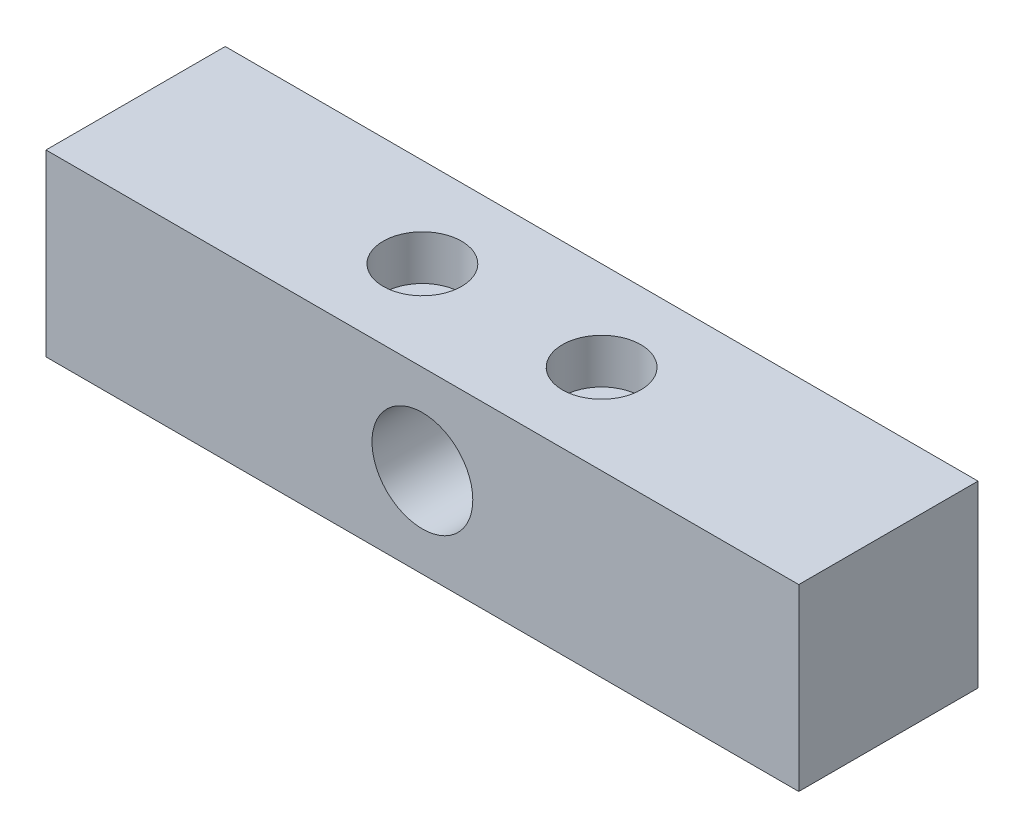
ISO-10303-21;
HEADER;
FILE_DESCRIPTION(('STEP AP214'),'2;1');
FILE_NAME('part.step','',(''),(''),'','','');
FILE_SCHEMA(('AUTOMOTIVE_DESIGN { 1 0 10303 214 1 1 1 1 }'));
ENDSEC;
DATA;
#1=APPLICATION_CONTEXT('core data for automotive mechanical design processes');
#2=APPLICATION_PROTOCOL_DEFINITION('international standard','automotive_design',2000,#1);
#3=PRODUCT_CONTEXT('',#1,'mechanical');
#4=PRODUCT('Part','Part','',(#3));
#5=PRODUCT_RELATED_PRODUCT_CATEGORY('part','',(#4));
#6=PRODUCT_DEFINITION_FORMATION('','',#4);
#7=PRODUCT_DEFINITION_CONTEXT('part definition',#1,'design');
#8=PRODUCT_DEFINITION('design','',#6,#7);
#9=PRODUCT_DEFINITION_SHAPE('','',#8);
#10=(LENGTH_UNIT() NAMED_UNIT(*) SI_UNIT(.MILLI.,.METRE.));
#11=(NAMED_UNIT(*) PLANE_ANGLE_UNIT() SI_UNIT($,.RADIAN.));
#12=(NAMED_UNIT(*) SI_UNIT($,.STERADIAN.) SOLID_ANGLE_UNIT());
#13=UNCERTAINTY_MEASURE_WITH_UNIT(LENGTH_MEASURE(1.E-05),#10,'distance_accuracy_value','');
#14=(GEOMETRIC_REPRESENTATION_CONTEXT(3) GLOBAL_UNCERTAINTY_ASSIGNED_CONTEXT((#13)) GLOBAL_UNIT_ASSIGNED_CONTEXT((#10,
#11,#12)) REPRESENTATION_CONTEXT('',''));
#15=CARTESIAN_POINT('',(0.,0.,0.));
#16=DIRECTION('',(0.,0.,1.));
#17=DIRECTION('',(1.,0.,0.));
#18=AXIS2_PLACEMENT_3D('',#15,#16,#17);
#19=CARTESIAN_POINT('',(53.34,12.7,25.4));
#20=DIRECTION('',(1.,0.,0.));
#21=DIRECTION('',(0.,0.,-1.));
#22=AXIS2_PLACEMENT_3D('',#19,#20,#21);
#23=PLANE('',#22);
#24=DIRECTION('',(0.,-1.,0.));
#25=VECTOR('',#24,1.);
#26=CARTESIAN_POINT('',(53.34,12.7,0.));
#27=LINE('',#26,#25);
#28=CARTESIAN_POINT('',(53.34,12.7,0.));
#29=VERTEX_POINT('',#28);
#30=CARTESIAN_POINT('',(53.34,-12.7,0.));
#31=VERTEX_POINT('',#30);
#32=EDGE_CURVE('E101',#29,#31,#27,.T.);
#33=ORIENTED_EDGE('',*,*,#32,.F.);
#34=DIRECTION('',(0.,0.,-1.));
#35=VECTOR('',#34,1.);
#36=CARTESIAN_POINT('',(53.34,12.7,25.4));
#37=LINE('',#36,#35);
#38=CARTESIAN_POINT('',(53.34,12.7,25.4));
#39=VERTEX_POINT('',#38);
#40=EDGE_CURVE('E11',#39,#29,#37,.T.);
#41=ORIENTED_EDGE('',*,*,#40,.F.);
#42=DIRECTION('',(0.,-1.,0.));
#43=VECTOR('',#42,1.);
#44=CARTESIAN_POINT('',(53.34,12.7,25.4));
#45=LINE('',#44,#43);
#46=CARTESIAN_POINT('',(53.34,-12.7,25.4));
#47=VERTEX_POINT('',#46);
#48=EDGE_CURVE('E95',#39,#47,#45,.T.);
#49=ORIENTED_EDGE('',*,*,#48,.T.);
#50=DIRECTION('',(0.,0.,-1.));
#51=VECTOR('',#50,1.);
#52=CARTESIAN_POINT('',(53.34,-12.7,25.4));
#53=LINE('',#52,#51);
#54=EDGE_CURVE('E38',#47,#31,#53,.T.);
#55=ORIENTED_EDGE('',*,*,#54,.T.);
#56=EDGE_LOOP('',(#33,#41,#49,#55));
#57=FACE_BOUND('',#56,.T.);
#58=ADVANCED_FACE('F35',(#57),#23,.T.);
#59=CARTESIAN_POINT('',(53.34,12.7,25.4));
#60=DIRECTION('',(0.,-1.,0.));
#61=DIRECTION('',(0.,0.,-1.));
#62=AXIS2_PLACEMENT_3D('',#59,#60,#61);
#63=PLANE('',#62);
#64=CARTESIAN_POINT('',(12.7,12.7,12.7));
#65=DIRECTION('',(0.,1.,0.));
#66=DIRECTION('',(0.,0.,1.));
#67=AXIS2_PLACEMENT_3D('',#64,#65,#66);
#68=CIRCLE('',#67,5.55625);
#69=CARTESIAN_POINT('',(12.7,12.7,18.25625));
#70=VERTEX_POINT('',#69);
#71=EDGE_CURVE('E231',#70,#70,#68,.T.);
#72=ORIENTED_EDGE('',*,*,#71,.F.);
#73=EDGE_LOOP('',(#72));
#74=FACE_BOUND('',#73,.T.);
#75=CARTESIAN_POINT('',(-12.7,12.7,12.7));
#76=DIRECTION('',(0.,1.,0.));
#77=DIRECTION('',(0.,0.,1.));
#78=AXIS2_PLACEMENT_3D('',#75,#76,#77);
#79=CIRCLE('',#78,5.55625);
#80=CARTESIAN_POINT('',(-12.7,12.7,18.25625));
#81=VERTEX_POINT('',#80);
#82=EDGE_CURVE('E239',#81,#81,#79,.T.);
#83=ORIENTED_EDGE('',*,*,#82,.F.);
#84=EDGE_LOOP('',(#83));
#85=FACE_BOUND('',#84,.T.);
#86=DIRECTION('',(-1.,0.,0.));
#87=VECTOR('',#86,1.);
#88=CARTESIAN_POINT('',(53.34,12.7,0.));
#89=LINE('',#88,#87);
#90=CARTESIAN_POINT('',(-53.34,12.7,0.));
#91=VERTEX_POINT('',#90);
#92=EDGE_CURVE('E68',#29,#91,#89,.T.);
#93=ORIENTED_EDGE('',*,*,#92,.T.);
#94=DIRECTION('',(0.,0.,-1.));
#95=VECTOR('',#94,1.);
#96=CARTESIAN_POINT('',(-53.34,12.7,25.4));
#97=LINE('',#96,#95);
#98=CARTESIAN_POINT('',(-53.34,12.7,25.4));
#99=VERTEX_POINT('',#98);
#100=EDGE_CURVE('E44',#99,#91,#97,.T.);
#101=ORIENTED_EDGE('',*,*,#100,.F.);
#102=DIRECTION('',(-1.,0.,0.));
#103=VECTOR('',#102,1.);
#104=CARTESIAN_POINT('',(53.34,12.7,25.4));
#105=LINE('',#104,#103);
#106=EDGE_CURVE('E85',#39,#99,#105,.T.);
#107=ORIENTED_EDGE('',*,*,#106,.F.);
#108=ORIENTED_EDGE('',*,*,#40,.T.);
#109=EDGE_LOOP('',(#93,#101,#107,#108));
#110=FACE_BOUND('',#109,.T.);
#111=ADVANCED_FACE('F112',(#74,#85,#110),#63,.F.);
#112=CARTESIAN_POINT('',(-53.34,12.7,25.4));
#113=DIRECTION('',(1.,0.,0.));
#114=DIRECTION('',(0.,0.,-1.));
#115=AXIS2_PLACEMENT_3D('',#112,#113,#114);
#116=PLANE('',#115);
#117=DIRECTION('',(0.,-1.,0.));
#118=VECTOR('',#117,1.);
#119=CARTESIAN_POINT('',(-53.34,12.7,0.));
#120=LINE('',#119,#118);
#121=CARTESIAN_POINT('',(-53.34,-12.7,0.));
#122=VERTEX_POINT('',#121);
#123=EDGE_CURVE('E92',#91,#122,#120,.T.);
#124=ORIENTED_EDGE('',*,*,#123,.T.);
#125=DIRECTION('',(0.,0.,-1.));
#126=VECTOR('',#125,1.);
#127=CARTESIAN_POINT('',(-53.34,-12.7,25.4));
#128=LINE('',#127,#126);
#129=CARTESIAN_POINT('',(-53.34,-12.7,25.4));
#130=VERTEX_POINT('',#129);
#131=EDGE_CURVE('E89',#130,#122,#128,.T.);
#132=ORIENTED_EDGE('',*,*,#131,.F.);
#133=DIRECTION('',(0.,-1.,0.));
#134=VECTOR('',#133,1.);
#135=CARTESIAN_POINT('',(-53.34,12.7,25.4));
#136=LINE('',#135,#134);
#137=EDGE_CURVE('E80',#99,#130,#136,.T.);
#138=ORIENTED_EDGE('',*,*,#137,.F.);
#139=ORIENTED_EDGE('',*,*,#100,.T.);
#140=EDGE_LOOP('',(#124,#132,#138,#139));
#141=FACE_BOUND('',#140,.T.);
#142=ADVANCED_FACE('F90',(#141),#116,.F.);
#143=CARTESIAN_POINT('',(53.34,-12.7,25.4));
#144=DIRECTION('',(0.,-1.,0.));
#145=DIRECTION('',(0.,0.,-1.));
#146=AXIS2_PLACEMENT_3D('',#143,#144,#145);
#147=PLANE('',#146);
#148=CARTESIAN_POINT('',(12.7,-12.7,12.7));
#149=DIRECTION('',(0.,-1.,0.));
#150=DIRECTION('',(0.,0.,-1.));
#151=AXIS2_PLACEMENT_3D('',#148,#149,#150);
#152=CIRCLE('',#151,3.3782);
#153=CARTESIAN_POINT('',(12.7,-12.7,9.32180000000001));
#154=VERTEX_POINT('',#153);
#155=EDGE_CURVE('E135',#154,#154,#152,.T.);
#156=ORIENTED_EDGE('',*,*,#155,.F.);
#157=EDGE_LOOP('',(#156));
#158=FACE_BOUND('',#157,.T.);
#159=CARTESIAN_POINT('',(-12.7,-12.7,12.7));
#160=DIRECTION('',(0.,-1.,0.));
#161=DIRECTION('',(0.,0.,-1.));
#162=AXIS2_PLACEMENT_3D('',#159,#160,#161);
#163=CIRCLE('',#162,3.3782);
#164=CARTESIAN_POINT('',(-12.7,-12.7,9.32180000000001));
#165=VERTEX_POINT('',#164);
#166=EDGE_CURVE('E138',#165,#165,#163,.T.);
#167=ORIENTED_EDGE('',*,*,#166,.F.);
#168=EDGE_LOOP('',(#167));
#169=FACE_BOUND('',#168,.T.);
#170=DIRECTION('',(-1.,0.,0.));
#171=VECTOR('',#170,1.);
#172=CARTESIAN_POINT('',(53.34,-12.7,0.));
#173=LINE('',#172,#171);
#174=EDGE_CURVE('E104',#31,#122,#173,.T.);
#175=ORIENTED_EDGE('',*,*,#174,.F.);
#176=ORIENTED_EDGE('',*,*,#54,.F.);
#177=DIRECTION('',(-1.,0.,0.));
#178=VECTOR('',#177,1.);
#179=CARTESIAN_POINT('',(53.34,-12.7,25.4));
#180=LINE('',#179,#178);
#181=EDGE_CURVE('E84',#47,#130,#180,.T.);
#182=ORIENTED_EDGE('',*,*,#181,.T.);
#183=ORIENTED_EDGE('',*,*,#131,.T.);
#184=EDGE_LOOP('',(#175,#176,#182,#183));
#185=FACE_BOUND('',#184,.T.);
#186=ADVANCED_FACE('F94',(#158,#169,#185),#147,.T.);
#187=CARTESIAN_POINT('',(0.,0.,25.4));
#188=DIRECTION('',(0.,0.,-1.));
#189=DIRECTION('',(-1.,0.,0.));
#190=AXIS2_PLACEMENT_3D('',#187,#188,#189);
#191=PLANE('',#190);
#192=CARTESIAN_POINT('',(0.,0.,25.4));
#193=DIRECTION('',(0.,0.,1.));
#194=DIRECTION('',(1.,0.,0.));
#195=AXIS2_PLACEMENT_3D('',#192,#193,#194);
#196=CIRCLE('',#195,7.14375);
#197=CARTESIAN_POINT('',(7.14375,0.,25.4));
#198=VERTEX_POINT('',#197);
#199=EDGE_CURVE('E140',#198,#198,#196,.T.);
#200=ORIENTED_EDGE('',*,*,#199,.F.);
#201=EDGE_LOOP('',(#200));
#202=FACE_BOUND('',#201,.T.);
#203=ORIENTED_EDGE('',*,*,#48,.F.);
#204=ORIENTED_EDGE('',*,*,#106,.T.);
#205=ORIENTED_EDGE('',*,*,#137,.T.);
#206=ORIENTED_EDGE('',*,*,#181,.F.);
#207=EDGE_LOOP('',(#203,#204,#205,#206));
#208=FACE_BOUND('',#207,.T.);
#209=ADVANCED_FACE('F83',(#202,#208),#191,.F.);
#210=CARTESIAN_POINT('',(0.,0.,0.));
#211=DIRECTION('',(0.,0.,-1.));
#212=DIRECTION('',(-1.,0.,0.));
#213=AXIS2_PLACEMENT_3D('',#210,#211,#212);
#214=PLANE('',#213);
#215=CARTESIAN_POINT('',(0.,0.,0.));
#216=DIRECTION('',(0.,0.,-1.));
#217=DIRECTION('',(-1.,0.,0.));
#218=AXIS2_PLACEMENT_3D('',#215,#216,#217);
#219=CIRCLE('',#218,3.3782);
#220=CARTESIAN_POINT('',(-3.3782,0.,0.));
#221=VERTEX_POINT('',#220);
#222=EDGE_CURVE('E156',#221,#221,#219,.T.);
#223=ORIENTED_EDGE('',*,*,#222,.F.);
#224=EDGE_LOOP('',(#223));
#225=FACE_BOUND('',#224,.T.);
#226=CARTESIAN_POINT('',(-38.1,0.,0.));
#227=DIRECTION('',(0.,0.,1.));
#228=DIRECTION('',(1.,0.,0.));
#229=AXIS2_PLACEMENT_3D('',#226,#227,#228);
#230=CIRCLE('',#229,8.128);
#231=CARTESIAN_POINT('',(-46.228,0.,0.));
#232=VERTEX_POINT('',#231);
#233=EDGE_CURVE('E162',#232,#232,#230,.T.);
#234=ORIENTED_EDGE('',*,*,#233,.T.);
#235=EDGE_LOOP('',(#234));
#236=FACE_BOUND('',#235,.T.);
#237=CARTESIAN_POINT('',(38.1,0.,0.));
#238=DIRECTION('',(0.,0.,1.));
#239=DIRECTION('',(1.,0.,0.));
#240=AXIS2_PLACEMENT_3D('',#237,#238,#239);
#241=CIRCLE('',#240,8.128);
#242=CARTESIAN_POINT('',(29.972,0.,0.));
#243=VERTEX_POINT('',#242);
#244=EDGE_CURVE('E165',#243,#243,#241,.T.);
#245=ORIENTED_EDGE('',*,*,#244,.T.);
#246=EDGE_LOOP('',(#245));
#247=FACE_BOUND('',#246,.T.);
#248=ORIENTED_EDGE('',*,*,#32,.T.);
#249=ORIENTED_EDGE('',*,*,#174,.T.);
#250=ORIENTED_EDGE('',*,*,#123,.F.);
#251=ORIENTED_EDGE('',*,*,#92,.F.);
#252=EDGE_LOOP('',(#248,#249,#250,#251));
#253=FACE_BOUND('',#252,.T.);
#254=ADVANCED_FACE('F110',(#225,#236,#247,#253),#214,.T.);
#255=CARTESIAN_POINT('',(38.1,0.,19.05));
#256=DIRECTION('',(0.,0.,-1.));
#257=DIRECTION('',(-1.,0.,0.));
#258=AXIS2_PLACEMENT_3D('',#255,#256,#257);
#259=CYLINDRICAL_SURFACE('',#258,8.128);
#260=CARTESIAN_POINT('',(38.1,0.,19.05));
#261=DIRECTION('',(0.,0.,1.));
#262=DIRECTION('',(1.,0.,0.));
#263=AXIS2_PLACEMENT_3D('',#260,#261,#262);
#264=CIRCLE('',#263,8.128);
#265=CARTESIAN_POINT('',(29.972,0.,19.05));
#266=VERTEX_POINT('',#265);
#267=EDGE_CURVE('E159',#266,#266,#264,.T.);
#268=CARTESIAN_POINT('',(29.972,0.,19.05));
#269=CARTESIAN_POINT('',(29.972,0.,18.8515625));
#270=CARTESIAN_POINT('',(29.972,0.,18.653125));
#271=CARTESIAN_POINT('',(29.972,0.,18.25625));
#272=CARTESIAN_POINT('',(29.972,0.,18.0578125));
#273=CARTESIAN_POINT('',(29.972,0.,17.6609375));
#274=CARTESIAN_POINT('',(29.972,0.,17.4625));
#275=CARTESIAN_POINT('',(29.972,0.,17.065625));
#276=CARTESIAN_POINT('',(29.972,0.,16.8671875));
#277=CARTESIAN_POINT('',(29.972,0.,16.4703125));
#278=CARTESIAN_POINT('',(29.972,0.,16.271875));
#279=CARTESIAN_POINT('',(29.972,0.,15.875));
#280=CARTESIAN_POINT('',(29.972,0.,15.6765625));
#281=CARTESIAN_POINT('',(29.972,0.,15.2796875));
#282=CARTESIAN_POINT('',(29.972,0.,15.08125));
#283=CARTESIAN_POINT('',(29.972,0.,14.684375));
#284=CARTESIAN_POINT('',(29.972,0.,14.4859375));
#285=CARTESIAN_POINT('',(29.972,0.,14.0890625));
#286=CARTESIAN_POINT('',(29.972,0.,13.890625));
#287=CARTESIAN_POINT('',(29.972,0.,13.49375));
#288=CARTESIAN_POINT('',(29.972,0.,13.2953125));
#289=CARTESIAN_POINT('',(29.972,0.,12.8984375));
#290=CARTESIAN_POINT('',(29.972,0.,12.7));
#291=CARTESIAN_POINT('',(29.972,0.,12.303125));
#292=CARTESIAN_POINT('',(29.972,0.,12.1046875));
#293=CARTESIAN_POINT('',(29.972,0.,11.7078125));
#294=CARTESIAN_POINT('',(29.972,0.,11.509375));
#295=CARTESIAN_POINT('',(29.972,0.,11.1125));
#296=CARTESIAN_POINT('',(29.972,0.,10.9140625));
#297=CARTESIAN_POINT('',(29.972,0.,10.5171875));
#298=CARTESIAN_POINT('',(29.972,0.,10.31875));
#299=CARTESIAN_POINT('',(29.972,0.,9.921875));
#300=CARTESIAN_POINT('',(29.972,0.,9.7234375));
#301=CARTESIAN_POINT('',(29.972,0.,9.3265625));
#302=CARTESIAN_POINT('',(29.972,0.,9.128125));
#303=CARTESIAN_POINT('',(29.972,0.,8.73125));
#304=CARTESIAN_POINT('',(29.972,0.,8.5328125));
#305=CARTESIAN_POINT('',(29.972,0.,8.1359375));
#306=CARTESIAN_POINT('',(29.972,0.,7.9375));
#307=CARTESIAN_POINT('',(29.972,0.,7.540625));
#308=CARTESIAN_POINT('',(29.972,0.,7.3421875));
#309=CARTESIAN_POINT('',(29.972,0.,6.9453125));
#310=CARTESIAN_POINT('',(29.972,0.,6.746875));
#311=CARTESIAN_POINT('',(29.972,0.,6.35));
#312=CARTESIAN_POINT('',(29.972,0.,6.1515625));
#313=CARTESIAN_POINT('',(29.972,0.,5.7546875));
#314=CARTESIAN_POINT('',(29.972,0.,5.55625));
#315=CARTESIAN_POINT('',(29.972,0.,5.159375));
#316=CARTESIAN_POINT('',(29.972,0.,4.9609375));
#317=CARTESIAN_POINT('',(29.972,0.,4.5640625));
#318=CARTESIAN_POINT('',(29.972,0.,4.365625));
#319=CARTESIAN_POINT('',(29.972,0.,3.96875));
#320=CARTESIAN_POINT('',(29.972,0.,3.7703125));
#321=CARTESIAN_POINT('',(29.972,0.,3.3734375));
#322=CARTESIAN_POINT('',(29.972,0.,3.175));
#323=CARTESIAN_POINT('',(29.972,0.,2.778125));
#324=CARTESIAN_POINT('',(29.972,0.,2.5796875));
#325=CARTESIAN_POINT('',(29.972,0.,2.1828125));
#326=CARTESIAN_POINT('',(29.972,0.,1.984375));
#327=CARTESIAN_POINT('',(29.972,0.,1.5875));
#328=CARTESIAN_POINT('',(29.972,0.,1.3890625));
#329=CARTESIAN_POINT('',(29.972,0.,0.992187500000001));
#330=CARTESIAN_POINT('',(29.972,0.,0.793750000000001));
#331=CARTESIAN_POINT('',(29.972,0.,0.396875));
#332=CARTESIAN_POINT('',(29.972,0.,0.1984375));
#333=CARTESIAN_POINT('',(29.972,0.,0.));
#334=B_SPLINE_CURVE_WITH_KNOTS('',3,(#268,#269,#270,#271,#272,#273,#274,#275,#276,#277,#278,
#279,#280,#281,#282,#283,#284,#285,#286,#287,#288,#289,#290,#291,#292,#293,#294,#295,#296,#297,
#298,#299,#300,#301,#302,#303,#304,#305,#306,#307,#308,#309,#310,#311,#312,#313,#314,#315,#316,
#317,#318,#319,#320,#321,#322,#323,#324,#325,#326,#327,#328,#329,#330,#331,#332,#333),
.UNSPECIFIED.,.F.,.F.,(4,2,2,2,2,2,2,2,2,2,2,2,2,2,2,2,2,2,2,2,2,2,2,2,2,2,2,2,2,2,2,2,4),(0.,
0.5953125,1.190625,1.7859375,2.38125,2.9765625,3.571875,4.1671875,4.7625,5.3578125,5.953125,
6.5484375,7.14375,7.7390625,8.334375,8.9296875,9.525,10.1203125,10.715625,11.3109375,11.90625,
12.5015625,13.096875,13.6921875,14.2875,14.8828125,15.478125,16.0734375,16.66875,17.2640625,
17.859375,18.4546875,19.05),.UNSPECIFIED.);
#335=EDGE_CURVE('BSEAM170',#266,#243,#334,.T.);
#336=ORIENTED_EDGE('',*,*,#267,.T.);
#337=ORIENTED_EDGE('',*,*,#244,.F.);
#338=ORIENTED_EDGE('',*,*,#335,.T.);
#339=ORIENTED_EDGE('',*,*,#335,.F.);
#340=EDGE_LOOP('',(#336,#338,#337,#339));
#341=FACE_BOUND('',#340,.T.);
#342=ADVANCED_FACE('F170',(#341),#259,.F.);
#343=CARTESIAN_POINT('',(38.1,0.,19.05));
#344=DIRECTION('',(0.,0.,1.));
#345=DIRECTION('',(1.,0.,0.));
#346=AXIS2_PLACEMENT_3D('',#343,#344,#345);
#347=PLANE('',#346);
#348=ORIENTED_EDGE('',*,*,#267,.F.);
#349=EDGE_LOOP('',(#348));
#350=FACE_BOUND('',#349,.T.);
#351=ADVANCED_FACE('F173',(#350),#347,.F.);
#352=CARTESIAN_POINT('',(-38.1,0.,19.05));
#353=DIRECTION('',(0.,0.,-1.));
#354=DIRECTION('',(-1.,0.,0.));
#355=AXIS2_PLACEMENT_3D('',#352,#353,#354);
#356=CYLINDRICAL_SURFACE('',#355,8.128);
#357=CARTESIAN_POINT('',(-38.1,0.,19.05));
#358=DIRECTION('',(0.,0.,1.));
#359=DIRECTION('',(1.,0.,0.));
#360=AXIS2_PLACEMENT_3D('',#357,#358,#359);
#361=CIRCLE('',#360,8.128);
#362=CARTESIAN_POINT('',(-46.228,0.,19.05));
#363=VERTEX_POINT('',#362);
#364=EDGE_CURVE('E105',#363,#363,#361,.T.);
#365=CARTESIAN_POINT('',(-46.228,0.,19.05));
#366=CARTESIAN_POINT('',(-46.228,0.,18.8515625));
#367=CARTESIAN_POINT('',(-46.228,0.,18.653125));
#368=CARTESIAN_POINT('',(-46.228,0.,18.25625));
#369=CARTESIAN_POINT('',(-46.228,0.,18.0578125));
#370=CARTESIAN_POINT('',(-46.228,0.,17.6609375));
#371=CARTESIAN_POINT('',(-46.228,0.,17.4625));
#372=CARTESIAN_POINT('',(-46.228,0.,17.065625));
#373=CARTESIAN_POINT('',(-46.228,0.,16.8671875));
#374=CARTESIAN_POINT('',(-46.228,0.,16.4703125));
#375=CARTESIAN_POINT('',(-46.228,0.,16.271875));
#376=CARTESIAN_POINT('',(-46.228,0.,15.875));
#377=CARTESIAN_POINT('',(-46.228,0.,15.6765625));
#378=CARTESIAN_POINT('',(-46.228,0.,15.2796875));
#379=CARTESIAN_POINT('',(-46.228,0.,15.08125));
#380=CARTESIAN_POINT('',(-46.228,0.,14.684375));
#381=CARTESIAN_POINT('',(-46.228,0.,14.4859375));
#382=CARTESIAN_POINT('',(-46.228,0.,14.0890625));
#383=CARTESIAN_POINT('',(-46.228,0.,13.890625));
#384=CARTESIAN_POINT('',(-46.228,0.,13.49375));
#385=CARTESIAN_POINT('',(-46.228,0.,13.2953125));
#386=CARTESIAN_POINT('',(-46.228,0.,12.8984375));
#387=CARTESIAN_POINT('',(-46.228,0.,12.7));
#388=CARTESIAN_POINT('',(-46.228,0.,12.303125));
#389=CARTESIAN_POINT('',(-46.228,0.,12.1046875));
#390=CARTESIAN_POINT('',(-46.228,0.,11.7078125));
#391=CARTESIAN_POINT('',(-46.228,0.,11.509375));
#392=CARTESIAN_POINT('',(-46.228,0.,11.1125));
#393=CARTESIAN_POINT('',(-46.228,0.,10.9140625));
#394=CARTESIAN_POINT('',(-46.228,0.,10.5171875));
#395=CARTESIAN_POINT('',(-46.228,0.,10.31875));
#396=CARTESIAN_POINT('',(-46.228,0.,9.921875));
#397=CARTESIAN_POINT('',(-46.228,0.,9.7234375));
#398=CARTESIAN_POINT('',(-46.228,0.,9.3265625));
#399=CARTESIAN_POINT('',(-46.228,0.,9.128125));
#400=CARTESIAN_POINT('',(-46.228,0.,8.73125));
#401=CARTESIAN_POINT('',(-46.228,0.,8.5328125));
#402=CARTESIAN_POINT('',(-46.228,0.,8.1359375));
#403=CARTESIAN_POINT('',(-46.228,0.,7.9375));
#404=CARTESIAN_POINT('',(-46.228,0.,7.540625));
#405=CARTESIAN_POINT('',(-46.228,0.,7.3421875));
#406=CARTESIAN_POINT('',(-46.228,0.,6.9453125));
#407=CARTESIAN_POINT('',(-46.228,0.,6.746875));
#408=CARTESIAN_POINT('',(-46.228,0.,6.35));
#409=CARTESIAN_POINT('',(-46.228,0.,6.1515625));
#410=CARTESIAN_POINT('',(-46.228,0.,5.7546875));
#411=CARTESIAN_POINT('',(-46.228,0.,5.55625));
#412=CARTESIAN_POINT('',(-46.228,0.,5.159375));
#413=CARTESIAN_POINT('',(-46.228,0.,4.9609375));
#414=CARTESIAN_POINT('',(-46.228,0.,4.5640625));
#415=CARTESIAN_POINT('',(-46.228,0.,4.365625));
#416=CARTESIAN_POINT('',(-46.228,0.,3.96875));
#417=CARTESIAN_POINT('',(-46.228,0.,3.7703125));
#418=CARTESIAN_POINT('',(-46.228,0.,3.3734375));
#419=CARTESIAN_POINT('',(-46.228,0.,3.175));
#420=CARTESIAN_POINT('',(-46.228,0.,2.778125));
#421=CARTESIAN_POINT('',(-46.228,0.,2.5796875));
#422=CARTESIAN_POINT('',(-46.228,0.,2.1828125));
#423=CARTESIAN_POINT('',(-46.228,0.,1.984375));
#424=CARTESIAN_POINT('',(-46.228,0.,1.5875));
#425=CARTESIAN_POINT('',(-46.228,0.,1.3890625));
#426=CARTESIAN_POINT('',(-46.228,0.,0.992187500000001));
#427=CARTESIAN_POINT('',(-46.228,0.,0.793750000000001));
#428=CARTESIAN_POINT('',(-46.228,0.,0.396875));
#429=CARTESIAN_POINT('',(-46.228,0.,0.1984375));
#430=CARTESIAN_POINT('',(-46.228,0.,0.));
#431=B_SPLINE_CURVE_WITH_KNOTS('',3,(#365,#366,#367,#368,#369,#370,#371,#372,#373,#374,#375,
#376,#377,#378,#379,#380,#381,#382,#383,#384,#385,#386,#387,#388,#389,#390,#391,#392,#393,#394,
#395,#396,#397,#398,#399,#400,#401,#402,#403,#404,#405,#406,#407,#408,#409,#410,#411,#412,#413,
#414,#415,#416,#417,#418,#419,#420,#421,#422,#423,#424,#425,#426,#427,#428,#429,#430),
.UNSPECIFIED.,.F.,.F.,(4,2,2,2,2,2,2,2,2,2,2,2,2,2,2,2,2,2,2,2,2,2,2,2,2,2,2,2,2,2,2,2,4),(0.,
0.5953125,1.190625,1.7859375,2.38125,2.9765625,3.571875,4.1671875,4.7625,5.3578125,5.953125,
6.5484375,7.14375,7.7390625,8.334375,8.9296875,9.525,10.1203125,10.715625,11.3109375,11.90625,
12.5015625,13.096875,13.6921875,14.2875,14.8828125,15.478125,16.0734375,16.66875,17.2640625,
17.859375,18.4546875,19.05),.UNSPECIFIED.);
#432=EDGE_CURVE('BSEAM175',#363,#232,#431,.T.);
#433=ORIENTED_EDGE('',*,*,#364,.T.);
#434=ORIENTED_EDGE('',*,*,#233,.F.);
#435=ORIENTED_EDGE('',*,*,#432,.T.);
#436=ORIENTED_EDGE('',*,*,#432,.F.);
#437=EDGE_LOOP('',(#433,#435,#434,#436));
#438=FACE_BOUND('',#437,.T.);
#439=ADVANCED_FACE('F175',(#438),#356,.F.);
#440=CARTESIAN_POINT('',(0.,0.,19.05));
#441=DIRECTION('',(0.,0.,1.));
#442=DIRECTION('',(1.,0.,0.));
#443=AXIS2_PLACEMENT_3D('',#440,#441,#442);
#444=PLANE('',#443);
#445=ORIENTED_EDGE('',*,*,#364,.F.);
#446=EDGE_LOOP('',(#445));
#447=FACE_BOUND('',#446,.T.);
#448=ADVANCED_FACE('F181',(#447),#444,.F.);
#449=CARTESIAN_POINT('',(0.,0.,25.4));
#450=DIRECTION('',(0.,0.,1.));
#451=DIRECTION('',(1.,0.,0.));
#452=AXIS2_PLACEMENT_3D('',#449,#450,#451);
#453=CYLINDRICAL_SURFACE('',#452,3.3782);
#454=CARTESIAN_POINT('',(0.,0.,6.35));
#455=DIRECTION('',(0.,0.,1.));
#456=DIRECTION('',(1.,0.,0.));
#457=AXIS2_PLACEMENT_3D('',#454,#455,#456);
#458=CIRCLE('',#457,3.3782);
#459=CARTESIAN_POINT('',(3.3782,0.,6.35));
#460=VERTEX_POINT('',#459);
#461=EDGE_CURVE('E153',#460,#460,#458,.T.);
#462=ORIENTED_EDGE('',*,*,#461,.T.);
#463=EDGE_LOOP('',(#462));
#464=FACE_BOUND('',#463,.T.);
#465=ORIENTED_EDGE('',*,*,#222,.T.);
#466=EDGE_LOOP('',(#465));
#467=FACE_BOUND('',#466,.T.);
#468=ADVANCED_FACE('F188',(#464,#467),#453,.F.);
#469=CARTESIAN_POINT('',(3.3782,0.,6.35));
#470=DIRECTION('',(0.,0.,-1.));
#471=DIRECTION('',(-1.,0.,0.));
#472=AXIS2_PLACEMENT_3D('',#469,#470,#471);
#473=PLANE('',#472);
#474=ORIENTED_EDGE('',*,*,#461,.F.);
#475=EDGE_LOOP('',(#474));
#476=FACE_BOUND('',#475,.T.);
#477=CARTESIAN_POINT('',(0.,0.,6.35));
#478=DIRECTION('',(0.,0.,1.));
#479=DIRECTION('',(1.,0.,0.));
#480=AXIS2_PLACEMENT_3D('',#477,#478,#479);
#481=CIRCLE('',#480,7.14375);
#482=CARTESIAN_POINT('',(7.14375,0.,6.35));
#483=VERTEX_POINT('',#482);
#484=EDGE_CURVE('E144',#483,#483,#481,.T.);
#485=ORIENTED_EDGE('',*,*,#484,.T.);
#486=EDGE_LOOP('',(#485));
#487=FACE_BOUND('',#486,.T.);
#488=ADVANCED_FACE('F192',(#476,#487),#473,.F.);
#489=CARTESIAN_POINT('',(0.,0.,25.4));
#490=DIRECTION('',(0.,0.,1.));
#491=DIRECTION('',(1.,0.,0.));
#492=AXIS2_PLACEMENT_3D('',#489,#490,#491);
#493=CYLINDRICAL_SURFACE('',#492,7.14375);
#494=ORIENTED_EDGE('',*,*,#484,.F.);
#495=EDGE_LOOP('',(#494));
#496=FACE_BOUND('',#495,.T.);
#497=ORIENTED_EDGE('',*,*,#199,.T.);
#498=EDGE_LOOP('',(#497));
#499=FACE_BOUND('',#498,.T.);
#500=ADVANCED_FACE('F196',(#496,#499),#493,.F.);
#501=CARTESIAN_POINT('',(-12.7,12.7,12.7));
#502=DIRECTION('',(0.,1.,0.));
#503=DIRECTION('',(0.,0.,1.));
#504=AXIS2_PLACEMENT_3D('',#501,#502,#503);
#505=CYLINDRICAL_SURFACE('',#504,3.3782);
#506=CARTESIAN_POINT('',(-12.7,6.35,12.7));
#507=DIRECTION('',(0.,1.,0.));
#508=DIRECTION('',(0.,0.,1.));
#509=AXIS2_PLACEMENT_3D('',#506,#507,#508);
#510=CIRCLE('',#509,3.3782);
#511=CARTESIAN_POINT('',(-12.7,6.35,16.0782));
#512=VERTEX_POINT('',#511);
#513=EDGE_CURVE('E141',#512,#512,#510,.T.);
#514=ORIENTED_EDGE('',*,*,#513,.T.);
#515=EDGE_LOOP('',(#514));
#516=FACE_BOUND('',#515,.T.);
#517=ORIENTED_EDGE('',*,*,#166,.T.);
#518=EDGE_LOOP('',(#517));
#519=FACE_BOUND('',#518,.T.);
#520=ADVANCED_FACE('F200',(#516,#519),#505,.F.);
#521=CARTESIAN_POINT('',(-9.3218,6.35,12.7));
#522=DIRECTION('',(0.,-1.,0.));
#523=DIRECTION('',(0.,0.,-1.));
#524=AXIS2_PLACEMENT_3D('',#521,#522,#523);
#525=PLANE('',#524);
#526=ORIENTED_EDGE('',*,*,#513,.F.);
#527=EDGE_LOOP('',(#526));
#528=FACE_BOUND('',#527,.T.);
#529=CARTESIAN_POINT('',(-12.7,6.35,12.7));
#530=DIRECTION('',(0.,1.,0.));
#531=DIRECTION('',(0.,0.,1.));
#532=AXIS2_PLACEMENT_3D('',#529,#530,#531);
#533=CIRCLE('',#532,5.55625);
#534=CARTESIAN_POINT('',(-12.7,6.35,18.25625));
#535=VERTEX_POINT('',#534);
#536=EDGE_CURVE('E147',#535,#535,#533,.T.);
#537=ORIENTED_EDGE('',*,*,#536,.T.);
#538=EDGE_LOOP('',(#537));
#539=FACE_BOUND('',#538,.T.);
#540=ADVANCED_FACE('F204',(#528,#539),#525,.F.);
#541=CARTESIAN_POINT('',(-12.7,12.7,12.7));
#542=DIRECTION('',(0.,1.,0.));
#543=DIRECTION('',(0.,0.,1.));
#544=AXIS2_PLACEMENT_3D('',#541,#542,#543);
#545=CYLINDRICAL_SURFACE('',#544,5.55625);
#546=ORIENTED_EDGE('',*,*,#536,.F.);
#547=EDGE_LOOP('',(#546));
#548=FACE_BOUND('',#547,.T.);
#549=ORIENTED_EDGE('',*,*,#82,.T.);
#550=EDGE_LOOP('',(#549));
#551=FACE_BOUND('',#550,.T.);
#552=ADVANCED_FACE('F208',(#548,#551),#545,.F.);
#553=CARTESIAN_POINT('',(12.7,12.7,12.7));
#554=DIRECTION('',(0.,1.,0.));
#555=DIRECTION('',(0.,0.,1.));
#556=AXIS2_PLACEMENT_3D('',#553,#554,#555);
#557=CYLINDRICAL_SURFACE('',#556,3.3782);
#558=CARTESIAN_POINT('',(12.7,6.35,12.7));
#559=DIRECTION('',(0.,1.,0.));
#560=DIRECTION('',(0.,0.,1.));
#561=AXIS2_PLACEMENT_3D('',#558,#559,#560);
#562=CIRCLE('',#561,3.3782);
#563=CARTESIAN_POINT('',(12.7,6.35,16.0782));
#564=VERTEX_POINT('',#563);
#565=EDGE_CURVE('E233',#564,#564,#562,.T.);
#566=ORIENTED_EDGE('',*,*,#565,.T.);
#567=EDGE_LOOP('',(#566));
#568=FACE_BOUND('',#567,.T.);
#569=ORIENTED_EDGE('',*,*,#155,.T.);
#570=EDGE_LOOP('',(#569));
#571=FACE_BOUND('',#570,.T.);
#572=ADVANCED_FACE('F212',(#568,#571),#557,.F.);
#573=CARTESIAN_POINT('',(16.0782,6.35,12.7));
#574=DIRECTION('',(0.,-1.,0.));
#575=DIRECTION('',(0.,0.,-1.));
#576=AXIS2_PLACEMENT_3D('',#573,#574,#575);
#577=PLANE('',#576);
#578=ORIENTED_EDGE('',*,*,#565,.F.);
#579=EDGE_LOOP('',(#578));
#580=FACE_BOUND('',#579,.T.);
#581=CARTESIAN_POINT('',(12.7,6.35,12.7));
#582=DIRECTION('',(0.,1.,0.));
#583=DIRECTION('',(0.,0.,1.));
#584=AXIS2_PLACEMENT_3D('',#581,#582,#583);
#585=CIRCLE('',#584,5.55625);
#586=CARTESIAN_POINT('',(12.7,6.35,18.25625));
#587=VERTEX_POINT('',#586);
#588=EDGE_CURVE('E229',#587,#587,#585,.T.);
#589=ORIENTED_EDGE('',*,*,#588,.T.);
#590=EDGE_LOOP('',(#589));
#591=FACE_BOUND('',#590,.T.);
#592=ADVANCED_FACE('F216',(#580,#591),#577,.F.);
#593=CARTESIAN_POINT('',(12.7,12.7,12.7));
#594=DIRECTION('',(0.,1.,0.));
#595=DIRECTION('',(0.,0.,1.));
#596=AXIS2_PLACEMENT_3D('',#593,#594,#595);
#597=CYLINDRICAL_SURFACE('',#596,5.55625);
#598=ORIENTED_EDGE('',*,*,#588,.F.);
#599=EDGE_LOOP('',(#598));
#600=FACE_BOUND('',#599,.T.);
#601=ORIENTED_EDGE('',*,*,#71,.T.);
#602=EDGE_LOOP('',(#601));
#603=FACE_BOUND('',#602,.T.);
#604=ADVANCED_FACE('F220',(#600,#603),#597,.F.);
#605=CLOSED_SHELL('',(#58,#111,#142,#186,#209,#254,#342,#351,#439,#448,#468,#488,#500,#520,#540,
#552,#572,#592,#604));
#606=MANIFOLD_SOLID_BREP('B2',#605);
#607=ADVANCED_BREP_SHAPE_REPRESENTATION('',(#18,#606),#14);
#608=SHAPE_DEFINITION_REPRESENTATION(#9,#607);
ENDSEC;
END-ISO-10303-21;
